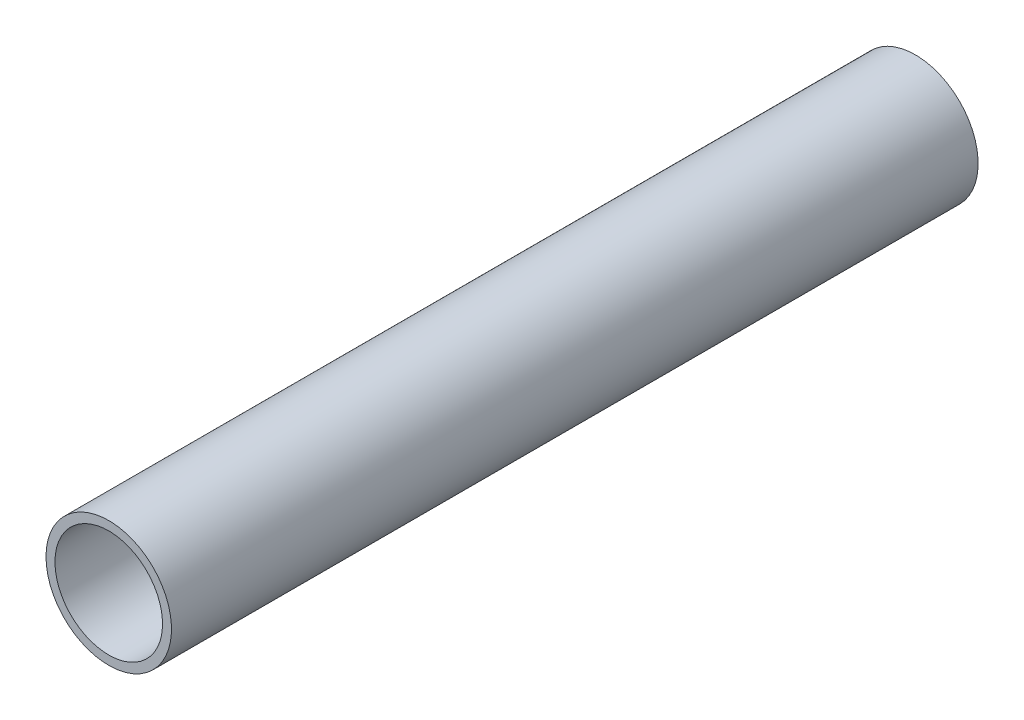
ISO-10303-21;
HEADER;
FILE_DESCRIPTION(('STEP AP214'),'2;1');
FILE_NAME('part.step','',(''),(''),'','','');
FILE_SCHEMA(('AUTOMOTIVE_DESIGN { 1 0 10303 214 1 1 1 1 }'));
ENDSEC;
DATA;
#1=APPLICATION_CONTEXT('core data for automotive mechanical design processes');
#2=APPLICATION_PROTOCOL_DEFINITION('international standard','automotive_design',2000,#1);
#3=PRODUCT_CONTEXT('',#1,'mechanical');
#4=PRODUCT('Part','Part','',(#3));
#5=PRODUCT_RELATED_PRODUCT_CATEGORY('part','',(#4));
#6=PRODUCT_DEFINITION_FORMATION('','',#4);
#7=PRODUCT_DEFINITION_CONTEXT('part definition',#1,'design');
#8=PRODUCT_DEFINITION('design','',#6,#7);
#9=PRODUCT_DEFINITION_SHAPE('','',#8);
#10=(LENGTH_UNIT() NAMED_UNIT(*) SI_UNIT(.MILLI.,.METRE.));
#11=(NAMED_UNIT(*) PLANE_ANGLE_UNIT() SI_UNIT($,.RADIAN.));
#12=(NAMED_UNIT(*) SI_UNIT($,.STERADIAN.) SOLID_ANGLE_UNIT());
#13=UNCERTAINTY_MEASURE_WITH_UNIT(LENGTH_MEASURE(1.E-05),#10,'distance_accuracy_value','');
#14=(GEOMETRIC_REPRESENTATION_CONTEXT(3) GLOBAL_UNCERTAINTY_ASSIGNED_CONTEXT((#13)) GLOBAL_UNIT_ASSIGNED_CONTEXT((#10,
#11,#12)) REPRESENTATION_CONTEXT('',''));
#15=CARTESIAN_POINT('',(0.,0.,0.));
#16=DIRECTION('',(0.,0.,1.));
#17=DIRECTION('',(1.,0.,0.));
#18=AXIS2_PLACEMENT_3D('',#15,#16,#17);
#19=CARTESIAN_POINT('',(0.,0.,90.));
#20=DIRECTION('',(0.,0.,1.));
#21=DIRECTION('',(1.,0.,0.));
#22=AXIS2_PLACEMENT_3D('',#19,#20,#21);
#23=PLANE('',#22);
#24=CARTESIAN_POINT('',(0.,0.,90.));
#25=DIRECTION('',(0.,0.,1.));
#26=DIRECTION('',(1.,0.,0.));
#27=AXIS2_PLACEMENT_3D('',#24,#25,#26);
#28=CIRCLE('',#27,7.);
#29=CARTESIAN_POINT('',(-7.,0.,90.));
#30=VERTEX_POINT('',#29);
#31=EDGE_CURVE('E10',#30,#30,#28,.T.);
#32=ORIENTED_EDGE('',*,*,#31,.T.);
#33=EDGE_LOOP('',(#32));
#34=FACE_BOUND('',#33,.T.);
#35=CARTESIAN_POINT('',(0.,0.,90.));
#36=DIRECTION('',(0.,0.,1.));
#37=DIRECTION('',(1.,0.,0.));
#38=AXIS2_PLACEMENT_3D('',#35,#36,#37);
#39=CIRCLE('',#38,6.);
#40=CARTESIAN_POINT('',(-6.,0.,90.));
#41=VERTEX_POINT('',#40);
#42=EDGE_CURVE('E41',#41,#41,#39,.T.);
#43=ORIENTED_EDGE('',*,*,#42,.F.);
#44=EDGE_LOOP('',(#43));
#45=FACE_BOUND('',#44,.T.);
#46=ADVANCED_FACE('F30',(#34,#45),#23,.T.);
#47=CARTESIAN_POINT('',(0.,0.,0.));
#48=DIRECTION('',(0.,0.,1.));
#49=DIRECTION('',(1.,0.,0.));
#50=AXIS2_PLACEMENT_3D('',#47,#48,#49);
#51=PLANE('',#50);
#52=CARTESIAN_POINT('',(0.,0.,0.));
#53=DIRECTION('',(0.,0.,1.));
#54=DIRECTION('',(1.,0.,0.));
#55=AXIS2_PLACEMENT_3D('',#52,#53,#54);
#56=CIRCLE('',#55,7.);
#57=CARTESIAN_POINT('',(-7.,0.,0.));
#58=VERTEX_POINT('',#57);
#59=EDGE_CURVE('E34',#58,#58,#56,.T.);
#60=ORIENTED_EDGE('',*,*,#59,.F.);
#61=EDGE_LOOP('',(#60));
#62=FACE_BOUND('',#61,.T.);
#63=CARTESIAN_POINT('',(0.,0.,0.));
#64=DIRECTION('',(0.,0.,1.));
#65=DIRECTION('',(1.,0.,0.));
#66=AXIS2_PLACEMENT_3D('',#63,#64,#65);
#67=CIRCLE('',#66,6.);
#68=CARTESIAN_POINT('',(-6.,0.,0.));
#69=VERTEX_POINT('',#68);
#70=EDGE_CURVE('E43',#69,#69,#67,.T.);
#71=ORIENTED_EDGE('',*,*,#70,.T.);
#72=EDGE_LOOP('',(#71));
#73=FACE_BOUND('',#72,.T.);
#74=ADVANCED_FACE('F53',(#62,#73),#51,.F.);
#75=CARTESIAN_POINT('',(0.,0.,90.));
#76=DIRECTION('',(0.,0.,-1.));
#77=DIRECTION('',(-1.,0.,0.));
#78=AXIS2_PLACEMENT_3D('',#75,#76,#77);
#79=CYLINDRICAL_SURFACE('',#78,7.);
#80=CARTESIAN_POINT('',(-7.,0.,90.));
#81=CARTESIAN_POINT('',(-7.,0.,89.0625));
#82=CARTESIAN_POINT('',(-7.,0.,88.125));
#83=CARTESIAN_POINT('',(-7.,0.,86.25));
#84=CARTESIAN_POINT('',(-7.,0.,85.3125));
#85=CARTESIAN_POINT('',(-7.,0.,83.4375));
#86=CARTESIAN_POINT('',(-7.,0.,82.5));
#87=CARTESIAN_POINT('',(-7.,0.,80.625));
#88=CARTESIAN_POINT('',(-7.,0.,79.6875));
#89=CARTESIAN_POINT('',(-7.,0.,77.8125));
#90=CARTESIAN_POINT('',(-7.,0.,76.875));
#91=CARTESIAN_POINT('',(-7.,0.,75.));
#92=CARTESIAN_POINT('',(-7.,0.,74.0625));
#93=CARTESIAN_POINT('',(-7.,0.,72.1875));
#94=CARTESIAN_POINT('',(-7.,0.,71.25));
#95=CARTESIAN_POINT('',(-7.,0.,69.375));
#96=CARTESIAN_POINT('',(-7.,0.,68.4375));
#97=CARTESIAN_POINT('',(-7.,0.,66.5625));
#98=CARTESIAN_POINT('',(-7.,0.,65.625));
#99=CARTESIAN_POINT('',(-7.,0.,63.75));
#100=CARTESIAN_POINT('',(-7.,0.,62.8125));
#101=CARTESIAN_POINT('',(-7.,0.,60.9375));
#102=CARTESIAN_POINT('',(-7.,0.,60.));
#103=CARTESIAN_POINT('',(-7.,0.,58.125));
#104=CARTESIAN_POINT('',(-7.,0.,57.1875));
#105=CARTESIAN_POINT('',(-7.,0.,55.3125));
#106=CARTESIAN_POINT('',(-7.,0.,54.375));
#107=CARTESIAN_POINT('',(-7.,0.,52.5));
#108=CARTESIAN_POINT('',(-7.,0.,51.5625));
#109=CARTESIAN_POINT('',(-7.,0.,49.6875));
#110=CARTESIAN_POINT('',(-7.,0.,48.75));
#111=CARTESIAN_POINT('',(-7.,0.,46.875));
#112=CARTESIAN_POINT('',(-7.,0.,45.9375));
#113=CARTESIAN_POINT('',(-7.,0.,44.0625));
#114=CARTESIAN_POINT('',(-7.,0.,43.125));
#115=CARTESIAN_POINT('',(-7.,0.,41.25));
#116=CARTESIAN_POINT('',(-7.,0.,40.3125));
#117=CARTESIAN_POINT('',(-7.,0.,38.4375));
#118=CARTESIAN_POINT('',(-7.,0.,37.5));
#119=CARTESIAN_POINT('',(-7.,0.,35.625));
#120=CARTESIAN_POINT('',(-7.,0.,34.6875));
#121=CARTESIAN_POINT('',(-7.,0.,32.8125));
#122=CARTESIAN_POINT('',(-7.,0.,31.875));
#123=CARTESIAN_POINT('',(-7.,0.,30.));
#124=CARTESIAN_POINT('',(-7.,0.,29.0625));
#125=CARTESIAN_POINT('',(-7.,0.,27.1875));
#126=CARTESIAN_POINT('',(-7.,0.,26.25));
#127=CARTESIAN_POINT('',(-7.,0.,24.375));
#128=CARTESIAN_POINT('',(-7.,0.,23.4375));
#129=CARTESIAN_POINT('',(-7.,0.,21.5625));
#130=CARTESIAN_POINT('',(-7.,0.,20.625));
#131=CARTESIAN_POINT('',(-7.,0.,18.75));
#132=CARTESIAN_POINT('',(-7.,0.,17.8125));
#133=CARTESIAN_POINT('',(-7.,0.,15.9375));
#134=CARTESIAN_POINT('',(-7.,0.,15.));
#135=CARTESIAN_POINT('',(-7.,0.,13.125));
#136=CARTESIAN_POINT('',(-7.,0.,12.1875));
#137=CARTESIAN_POINT('',(-7.,0.,10.3125));
#138=CARTESIAN_POINT('',(-7.,0.,9.37499999999999));
#139=CARTESIAN_POINT('',(-7.,0.,7.49999999999999));
#140=CARTESIAN_POINT('',(-7.,0.,6.56249999999999));
#141=CARTESIAN_POINT('',(-7.,0.,4.68749999999999));
#142=CARTESIAN_POINT('',(-7.,0.,3.74999999999998));
#143=CARTESIAN_POINT('',(-7.,0.,1.87499999999998));
#144=CARTESIAN_POINT('',(-7.,0.,0.937499999999986));
#145=CARTESIAN_POINT('',(-7.,0.,0.));
#146=B_SPLINE_CURVE_WITH_KNOTS('',3,(#80,#81,#82,#83,#84,#85,#86,#87,#88,#89,#90,#91,#92,#93,
#94,#95,#96,#97,#98,#99,#100,#101,#102,#103,#104,#105,#106,#107,#108,#109,#110,#111,#112,#113,
#114,#115,#116,#117,#118,#119,#120,#121,#122,#123,#124,#125,#126,#127,#128,#129,#130,#131,#132,
#133,#134,#135,#136,#137,#138,#139,#140,#141,#142,#143,#144,#145),.UNSPECIFIED.,.F.,.F.,(4,2,2,
2,2,2,2,2,2,2,2,2,2,2,2,2,2,2,2,2,2,2,2,2,2,2,2,2,2,2,2,2,4),(0.,2.81250000000001,
5.62500000000001,8.43750000000001,11.25,14.0625,16.875,19.6875,22.5,25.3125,28.125,30.9375,
33.75,36.5625,39.375,42.1875,45.,47.8125,50.625,53.4375,56.25,59.0625,61.875,64.6875,67.5,
70.3125,73.125,75.9375,78.75,81.5625,84.375,87.1875,90.),.UNSPECIFIED.);
#147=EDGE_CURVE('BSEAM32',#30,#58,#146,.T.);
#148=ORIENTED_EDGE('',*,*,#31,.F.);
#149=ORIENTED_EDGE('',*,*,#59,.T.);
#150=ORIENTED_EDGE('',*,*,#147,.T.);
#151=ORIENTED_EDGE('',*,*,#147,.F.);
#152=EDGE_LOOP('',(#148,#150,#149,#151));
#153=FACE_BOUND('',#152,.T.);
#154=ADVANCED_FACE('F32',(#153),#79,.T.);
#155=CARTESIAN_POINT('',(0.,0.,90.));
#156=DIRECTION('',(0.,0.,-1.));
#157=DIRECTION('',(-1.,0.,0.));
#158=AXIS2_PLACEMENT_3D('',#155,#156,#157);
#159=CYLINDRICAL_SURFACE('',#158,6.);
#160=CARTESIAN_POINT('',(-6.,0.,90.));
#161=CARTESIAN_POINT('',(-6.,0.,89.0625));
#162=CARTESIAN_POINT('',(-6.,0.,88.125));
#163=CARTESIAN_POINT('',(-6.,0.,86.25));
#164=CARTESIAN_POINT('',(-6.,0.,85.3125));
#165=CARTESIAN_POINT('',(-6.,0.,83.4375));
#166=CARTESIAN_POINT('',(-6.,0.,82.5));
#167=CARTESIAN_POINT('',(-6.,0.,80.625));
#168=CARTESIAN_POINT('',(-6.,0.,79.6875));
#169=CARTESIAN_POINT('',(-6.,0.,77.8125));
#170=CARTESIAN_POINT('',(-6.,0.,76.875));
#171=CARTESIAN_POINT('',(-6.,0.,75.));
#172=CARTESIAN_POINT('',(-6.,0.,74.0625));
#173=CARTESIAN_POINT('',(-6.,0.,72.1875));
#174=CARTESIAN_POINT('',(-6.,0.,71.25));
#175=CARTESIAN_POINT('',(-6.,0.,69.375));
#176=CARTESIAN_POINT('',(-6.,0.,68.4375));
#177=CARTESIAN_POINT('',(-6.,0.,66.5625));
#178=CARTESIAN_POINT('',(-6.,0.,65.625));
#179=CARTESIAN_POINT('',(-6.,0.,63.75));
#180=CARTESIAN_POINT('',(-6.,0.,62.8125));
#181=CARTESIAN_POINT('',(-6.,0.,60.9375));
#182=CARTESIAN_POINT('',(-6.,0.,60.));
#183=CARTESIAN_POINT('',(-6.,0.,58.125));
#184=CARTESIAN_POINT('',(-6.,0.,57.1875));
#185=CARTESIAN_POINT('',(-6.,0.,55.3125));
#186=CARTESIAN_POINT('',(-6.,0.,54.375));
#187=CARTESIAN_POINT('',(-6.,0.,52.5));
#188=CARTESIAN_POINT('',(-6.,0.,51.5625));
#189=CARTESIAN_POINT('',(-6.,0.,49.6875));
#190=CARTESIAN_POINT('',(-6.,0.,48.75));
#191=CARTESIAN_POINT('',(-6.,0.,46.875));
#192=CARTESIAN_POINT('',(-6.,0.,45.9375));
#193=CARTESIAN_POINT('',(-6.,0.,44.0625));
#194=CARTESIAN_POINT('',(-6.,0.,43.125));
#195=CARTESIAN_POINT('',(-6.,0.,41.25));
#196=CARTESIAN_POINT('',(-6.,0.,40.3125));
#197=CARTESIAN_POINT('',(-6.,0.,38.4375));
#198=CARTESIAN_POINT('',(-6.,0.,37.5));
#199=CARTESIAN_POINT('',(-6.,0.,35.625));
#200=CARTESIAN_POINT('',(-6.,0.,34.6875));
#201=CARTESIAN_POINT('',(-6.,0.,32.8125));
#202=CARTESIAN_POINT('',(-6.,0.,31.875));
#203=CARTESIAN_POINT('',(-6.,0.,30.));
#204=CARTESIAN_POINT('',(-6.,0.,29.0625));
#205=CARTESIAN_POINT('',(-6.,0.,27.1875));
#206=CARTESIAN_POINT('',(-6.,0.,26.25));
#207=CARTESIAN_POINT('',(-6.,0.,24.375));
#208=CARTESIAN_POINT('',(-6.,0.,23.4375));
#209=CARTESIAN_POINT('',(-6.,0.,21.5625));
#210=CARTESIAN_POINT('',(-6.,0.,20.625));
#211=CARTESIAN_POINT('',(-6.,0.,18.75));
#212=CARTESIAN_POINT('',(-6.,0.,17.8125));
#213=CARTESIAN_POINT('',(-6.,0.,15.9375));
#214=CARTESIAN_POINT('',(-6.,0.,15.));
#215=CARTESIAN_POINT('',(-6.,0.,13.125));
#216=CARTESIAN_POINT('',(-6.,0.,12.1875));
#217=CARTESIAN_POINT('',(-6.,0.,10.3125));
#218=CARTESIAN_POINT('',(-6.,0.,9.37499999999999));
#219=CARTESIAN_POINT('',(-6.,0.,7.49999999999999));
#220=CARTESIAN_POINT('',(-6.,0.,6.56249999999999));
#221=CARTESIAN_POINT('',(-6.,0.,4.68749999999999));
#222=CARTESIAN_POINT('',(-6.,0.,3.74999999999998));
#223=CARTESIAN_POINT('',(-6.,0.,1.87499999999998));
#224=CARTESIAN_POINT('',(-6.,0.,0.937499999999986));
#225=CARTESIAN_POINT('',(-6.,0.,0.));
#226=B_SPLINE_CURVE_WITH_KNOTS('',3,(#160,#161,#162,#163,#164,#165,#166,#167,#168,#169,#170,
#171,#172,#173,#174,#175,#176,#177,#178,#179,#180,#181,#182,#183,#184,#185,#186,#187,#188,#189,
#190,#191,#192,#193,#194,#195,#196,#197,#198,#199,#200,#201,#202,#203,#204,#205,#206,#207,#208,
#209,#210,#211,#212,#213,#214,#215,#216,#217,#218,#219,#220,#221,#222,#223,#224,#225),
.UNSPECIFIED.,.F.,.F.,(4,2,2,2,2,2,2,2,2,2,2,2,2,2,2,2,2,2,2,2,2,2,2,2,2,2,2,2,2,2,2,2,4),(0.,
2.81250000000001,5.62500000000001,8.43750000000001,11.25,14.0625,16.875,19.6875,22.5,25.3125,
28.125,30.9375,33.75,36.5625,39.375,42.1875,45.,47.8125,50.625,53.4375,56.25,59.0625,61.875,
64.6875,67.5,70.3125,73.125,75.9375,78.75,81.5625,84.375,87.1875,90.),.UNSPECIFIED.);
#227=EDGE_CURVE('BSEAM49',#41,#69,#226,.T.);
#228=ORIENTED_EDGE('',*,*,#42,.T.);
#229=ORIENTED_EDGE('',*,*,#70,.F.);
#230=ORIENTED_EDGE('',*,*,#227,.T.);
#231=ORIENTED_EDGE('',*,*,#227,.F.);
#232=EDGE_LOOP('',(#228,#230,#229,#231));
#233=FACE_BOUND('',#232,.T.);
#234=ADVANCED_FACE('F49',(#233),#159,.F.);
#235=CLOSED_SHELL('',(#46,#74,#154,#234));
#236=MANIFOLD_SOLID_BREP('B2',#235);
#237=ADVANCED_BREP_SHAPE_REPRESENTATION('',(#18,#236),#14);
#238=SHAPE_DEFINITION_REPRESENTATION(#9,#237);
ENDSEC;
END-ISO-10303-21;
